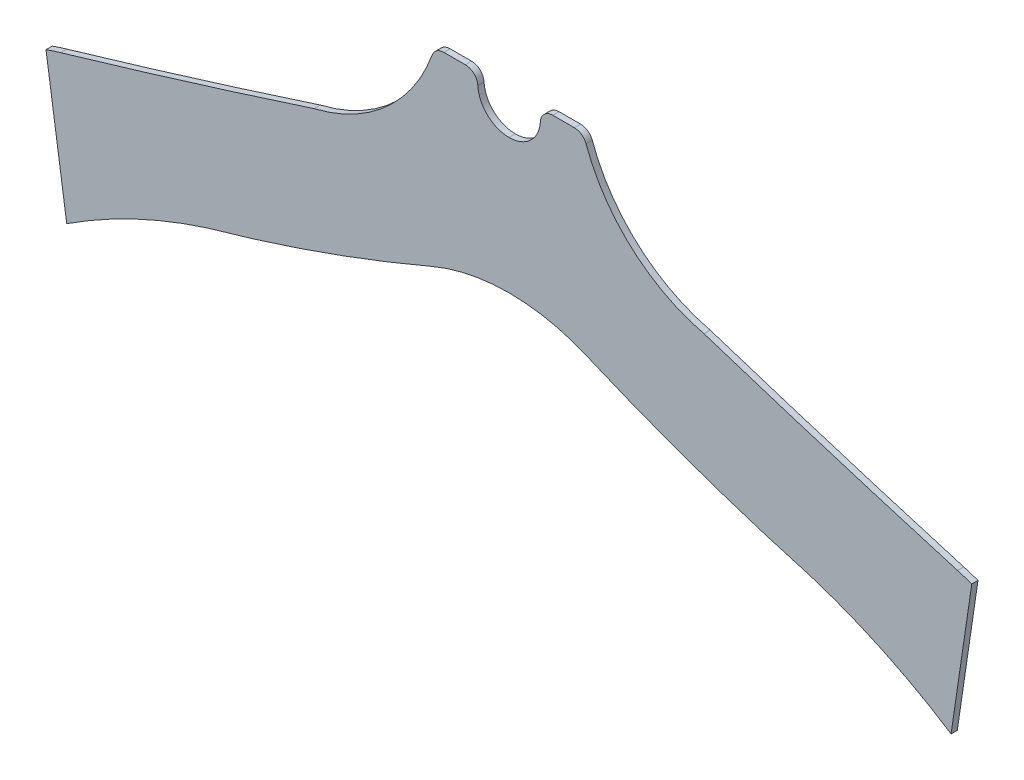
ISO-10303-21;
HEADER;
FILE_DESCRIPTION(('STEP AP214'),'2;1');
FILE_NAME('part.step','',(''),(''),'','','');
FILE_SCHEMA(('AUTOMOTIVE_DESIGN { 1 0 10303 214 1 1 1 1 }'));
ENDSEC;
DATA;
#1=APPLICATION_CONTEXT('core data for automotive mechanical design processes');
#2=APPLICATION_PROTOCOL_DEFINITION('international standard','automotive_design',2000,#1);
#3=PRODUCT_CONTEXT('',#1,'mechanical');
#4=PRODUCT('Part','Part','',(#3));
#5=PRODUCT_RELATED_PRODUCT_CATEGORY('part','',(#4));
#6=PRODUCT_DEFINITION_FORMATION('','',#4);
#7=PRODUCT_DEFINITION_CONTEXT('part definition',#1,'design');
#8=PRODUCT_DEFINITION('design','',#6,#7);
#9=PRODUCT_DEFINITION_SHAPE('','',#8);
#10=(LENGTH_UNIT() NAMED_UNIT(*) SI_UNIT(.MILLI.,.METRE.));
#11=(NAMED_UNIT(*) PLANE_ANGLE_UNIT() SI_UNIT($,.RADIAN.));
#12=(NAMED_UNIT(*) SI_UNIT($,.STERADIAN.) SOLID_ANGLE_UNIT());
#13=UNCERTAINTY_MEASURE_WITH_UNIT(LENGTH_MEASURE(1.E-05),#10,'distance_accuracy_value','');
#14=(GEOMETRIC_REPRESENTATION_CONTEXT(3) GLOBAL_UNCERTAINTY_ASSIGNED_CONTEXT((#13)) GLOBAL_UNIT_ASSIGNED_CONTEXT((#10,
#11,#12)) REPRESENTATION_CONTEXT('',''));
#15=CARTESIAN_POINT('',(0.,0.,0.));
#16=DIRECTION('',(0.,0.,1.));
#17=DIRECTION('',(1.,0.,0.));
#18=AXIS2_PLACEMENT_3D('',#15,#16,#17);
#19=CARTESIAN_POINT('',(-600.745447716728,679.701236138692,0.));
#20=DIRECTION('',(-0.989272155517059,-0.14608423021884,0.));
#21=DIRECTION('',(0.146084230218841,-0.989272155517059,0.));
#22=AXIS2_PLACEMENT_3D('',#19,#20,#21);
#23=PLANE('',#22);
#24=DIRECTION('',(0.,0.,-1.));
#25=VECTOR('',#24,1.);
#26=CARTESIAN_POINT('',(-451.112265587926,-333.604172663373,6.35));
#27=LINE('',#26,#25);
#28=CARTESIAN_POINT('',(-451.112265587926,-333.604172663373,6.35));
#29=VERTEX_POINT('',#28);
#30=CARTESIAN_POINT('',(-451.112265587926,-333.604172663373,0.));
#31=VERTEX_POINT('',#30);
#32=EDGE_CURVE('E268',#29,#31,#27,.T.);
#33=ORIENTED_EDGE('',*,*,#32,.F.);
#34=DIRECTION('',(0.146084230218841,-0.989272155517059,0.));
#35=VECTOR('',#34,1.);
#36=CARTESIAN_POINT('',(-231.23791311845,-1822.57785780754,6.35));
#37=LINE('',#36,#35);
#38=CARTESIAN_POINT('',(-472.255241426129,-190.425424004661,6.35));
#39=VERTEX_POINT('',#38);
#40=EDGE_CURVE('E271',#39,#29,#37,.T.);
#41=ORIENTED_EDGE('',*,*,#40,.F.);
#42=DIRECTION('',(0.,0.,-1.));
#43=VECTOR('',#42,1.);
#44=CARTESIAN_POINT('',(-472.255241426129,-190.425424004661,6.35));
#45=LINE('',#44,#43);
#46=CARTESIAN_POINT('',(-472.255241426129,-190.425424004661,0.));
#47=VERTEX_POINT('',#46);
#48=EDGE_CURVE('E263',#39,#47,#45,.T.);
#49=ORIENTED_EDGE('',*,*,#48,.T.);
#50=DIRECTION('',(0.146084230218841,-0.989272155517059,0.));
#51=VECTOR('',#50,1.);
#52=CARTESIAN_POINT('',(-231.23791311845,-1822.57785780754,0.));
#53=LINE('',#52,#51);
#54=EDGE_CURVE('E260',#47,#31,#53,.T.);
#55=ORIENTED_EDGE('',*,*,#54,.T.);
#56=EDGE_LOOP('',(#33,#41,#49,#55));
#57=FACE_BOUND('',#56,.T.);
#58=ADVANCED_FACE('F36',(#57),#23,.T.);
#59=CARTESIAN_POINT('',(600.745447716728,679.701236138692,0.));
#60=DIRECTION('',(0.989272155517059,-0.14608423021884,0.));
#61=DIRECTION('',(-0.146084230218841,-0.989272155517059,0.));
#62=AXIS2_PLACEMENT_3D('',#59,#60,#61);
#63=PLANE('',#62);
#64=DIRECTION('',(0.,0.,-1.));
#65=VECTOR('',#64,1.);
#66=CARTESIAN_POINT('',(451.151920246399,-333.335634098976,6.35));
#67=LINE('',#66,#65);
#68=CARTESIAN_POINT('',(451.151920246399,-333.335634098976,0.));
#69=VERTEX_POINT('',#68);
#70=CARTESIAN_POINT('',(451.151920246399,-333.335634098976,6.35));
#71=VERTEX_POINT('',#70);
#72=EDGE_CURVE('E272',#69,#71,#67,.F.);
#73=ORIENTED_EDGE('',*,*,#72,.F.);
#74=DIRECTION('',(0.146084230218841,0.989272155517059,0.));
#75=VECTOR('',#74,1.);
#76=CARTESIAN_POINT('',(223.926911417989,-1872.08744827031,0.));
#77=LINE('',#76,#75);
#78=CARTESIAN_POINT('',(472.277440645089,-190.275092451706,0.));
#79=VERTEX_POINT('',#78);
#80=EDGE_CURVE('E264',#69,#79,#77,.T.);
#81=ORIENTED_EDGE('',*,*,#80,.T.);
#82=DIRECTION('',(0.,0.,-1.));
#83=VECTOR('',#82,1.);
#84=CARTESIAN_POINT('',(472.277440645089,-190.275092451706,6.35));
#85=LINE('',#84,#83);
#86=CARTESIAN_POINT('',(472.277440645089,-190.275092451706,6.35));
#87=VERTEX_POINT('',#86);
#88=EDGE_CURVE('E267',#79,#87,#85,.F.);
#89=ORIENTED_EDGE('',*,*,#88,.T.);
#90=DIRECTION('',(0.146084230218841,0.989272155517059,0.));
#91=VECTOR('',#90,1.);
#92=CARTESIAN_POINT('',(223.926911417989,-1872.08744827031,6.35));
#93=LINE('',#92,#91);
#94=EDGE_CURVE('E40',#71,#87,#93,.T.);
#95=ORIENTED_EDGE('',*,*,#94,.F.);
#96=EDGE_LOOP('',(#73,#81,#89,#95));
#97=FACE_BOUND('',#96,.T.);
#98=ADVANCED_FACE('F415',(#97),#63,.T.);
#99=CARTESIAN_POINT('',(-129.060690383093,-828.309515919683,6.35));
#100=DIRECTION('',(0.,0.,-1.));
#101=DIRECTION('',(-1.,0.,0.));
#102=AXIS2_PLACEMENT_3D('',#99,#100,#101);
#103=CYLINDRICAL_SURFACE('',#102,590.297038564702);
#104=CARTESIAN_POINT('',(-129.060690383093,-828.309515919683,6.35));
#105=DIRECTION('',(0.,0.,1.));
#106=DIRECTION('',(1.,0.,0.));
#107=AXIS2_PLACEMENT_3D('',#104,#105,#106);
#108=CIRCLE('',#107,590.297038564702);
#109=CARTESIAN_POINT('',(-307.494270251192,-265.626611155709,6.35));
#110=VERTEX_POINT('',#109);
#111=EDGE_CURVE('E210',#110,#29,#108,.T.);
#112=ORIENTED_EDGE('',*,*,#111,.T.);
#113=ORIENTED_EDGE('',*,*,#32,.T.);
#114=CARTESIAN_POINT('',(-129.060690383093,-828.309515919683,0.));
#115=DIRECTION('',(0.,0.,1.));
#116=DIRECTION('',(1.,0.,0.));
#117=AXIS2_PLACEMENT_3D('',#114,#115,#116);
#118=CIRCLE('',#117,590.297038564702);
#119=CARTESIAN_POINT('',(-307.494270251192,-265.626611155709,0.));
#120=VERTEX_POINT('',#119);
#121=EDGE_CURVE('E251',#120,#31,#118,.T.);
#122=ORIENTED_EDGE('',*,*,#121,.F.);
#123=DIRECTION('',(0.,0.,-1.));
#124=VECTOR('',#123,1.);
#125=CARTESIAN_POINT('',(-307.494270251192,-265.626611155709,6.35));
#126=LINE('',#125,#124);
#127=EDGE_CURVE('E308',#110,#120,#126,.T.);
#128=ORIENTED_EDGE('',*,*,#127,.F.);
#129=EDGE_LOOP('',(#112,#113,#122,#128));
#130=FACE_BOUND('',#129,.T.);
#131=ADVANCED_FACE('F417',(#130),#103,.F.);
#132=CARTESIAN_POINT('',(-803.248156582129,1509.44347893388,6.35));
#133=DIRECTION('',(0.,0.,-1.));
#134=DIRECTION('',(-1.,0.,0.));
#135=AXIS2_PLACEMENT_3D('',#132,#133,#134);
#136=CYLINDRICAL_SURFACE('',#135,1842.99911571951);
#137=CARTESIAN_POINT('',(-803.248156582129,1509.44347893388,0.));
#138=DIRECTION('',(0.,0.,1.));
#139=DIRECTION('',(1.,0.,0.));
#140=AXIS2_PLACEMENT_3D('',#137,#138,#139);
#141=CIRCLE('',#140,1842.99911571951);
#142=CARTESIAN_POINT('',(-78.8538194249149,-185.224212632065,0.));
#143=VERTEX_POINT('',#142);
#144=EDGE_CURVE('E255',#120,#143,#141,.T.);
#145=ORIENTED_EDGE('',*,*,#144,.T.);
#146=DIRECTION('',(0.,0.,-1.));
#147=VECTOR('',#146,1.);
#148=CARTESIAN_POINT('',(-78.8538194249149,-185.224212632065,6.35));
#149=LINE('',#148,#147);
#150=CARTESIAN_POINT('',(-78.8538194249149,-185.224212632065,6.35));
#151=VERTEX_POINT('',#150);
#152=EDGE_CURVE('E311',#151,#143,#149,.T.);
#153=ORIENTED_EDGE('',*,*,#152,.F.);
#154=CARTESIAN_POINT('',(-803.248156582129,1509.44347893388,6.35));
#155=DIRECTION('',(0.,0.,1.));
#156=DIRECTION('',(1.,0.,0.));
#157=AXIS2_PLACEMENT_3D('',#154,#155,#156);
#158=CIRCLE('',#157,1842.99911571951);
#159=EDGE_CURVE('E207',#110,#151,#158,.T.);
#160=ORIENTED_EDGE('',*,*,#159,.F.);
#161=ORIENTED_EDGE('',*,*,#127,.T.);
#162=EDGE_LOOP('',(#145,#153,#160,#161));
#163=FACE_BOUND('',#162,.T.);
#164=ADVANCED_FACE('F423',(#163),#136,.T.);
#165=CARTESIAN_POINT('',(-0.134857005973377,-369.381480964208,6.35));
#166=DIRECTION('',(0.,0.,-1.));
#167=DIRECTION('',(-1.,0.,0.));
#168=AXIS2_PLACEMENT_3D('',#165,#166,#167);
#169=CYLINDRICAL_SURFACE('',#168,200.276245530728);
#170=CARTESIAN_POINT('',(-0.134857005973377,-369.381480964208,0.));
#171=DIRECTION('',(0.,0.,1.));
#172=DIRECTION('',(1.,0.,0.));
#173=AXIS2_PLACEMENT_3D('',#170,#171,#172);
#174=CIRCLE('',#173,200.276245530728);
#175=CARTESIAN_POINT('',(0.226267484348874,-169.105561011291,0.));
#176=VERTEX_POINT('',#175);
#177=EDGE_CURVE('E279',#176,#143,#174,.T.);
#178=ORIENTED_EDGE('',*,*,#177,.F.);
#179=DIRECTION('',(0.,0.,-1.));
#180=VECTOR('',#179,1.);
#181=CARTESIAN_POINT('',(0.226267484348874,-169.105561011291,6.35));
#182=LINE('',#181,#180);
#183=CARTESIAN_POINT('',(0.226267484348874,-169.105561011291,6.35));
#184=VERTEX_POINT('',#183);
#185=EDGE_CURVE('E127',#184,#176,#182,.T.);
#186=ORIENTED_EDGE('',*,*,#185,.F.);
#187=CARTESIAN_POINT('',(-0.134857005973377,-369.381480964208,6.35));
#188=DIRECTION('',(0.,0.,1.));
#189=DIRECTION('',(1.,0.,0.));
#190=AXIS2_PLACEMENT_3D('',#187,#188,#189);
#191=CIRCLE('',#190,200.276245530728);
#192=EDGE_CURVE('E204',#184,#151,#191,.T.);
#193=ORIENTED_EDGE('',*,*,#192,.T.);
#194=ORIENTED_EDGE('',*,*,#152,.T.);
#195=EDGE_LOOP('',(#178,#186,#193,#194));
#196=FACE_BOUND('',#195,.T.);
#197=ADVANCED_FACE('F472',(#196),#169,.F.);
#198=CARTESIAN_POINT('',(0.587391974440798,-369.381480964206,6.35));
#199=DIRECTION('',(0.,0.,-1.));
#200=DIRECTION('',(-1.,0.,0.));
#201=AXIS2_PLACEMENT_3D('',#198,#199,#200);
#202=CYLINDRICAL_SURFACE('',#201,200.276245530727);
#203=CARTESIAN_POINT('',(0.587391974440798,-369.381480964206,0.));
#204=DIRECTION('',(0.,0.,1.));
#205=DIRECTION('',(1.,0.,0.));
#206=AXIS2_PLACEMENT_3D('',#203,#204,#205);
#207=CIRCLE('',#206,200.276245530727);
#208=CARTESIAN_POINT('',(79.3063543933814,-185.224212632063,0.));
#209=VERTEX_POINT('',#208);
#210=EDGE_CURVE('E250',#209,#176,#207,.T.);
#211=ORIENTED_EDGE('',*,*,#210,.F.);
#212=DIRECTION('',(0.,0.,-1.));
#213=VECTOR('',#212,1.);
#214=CARTESIAN_POINT('',(79.3063543933814,-185.224212632063,6.35));
#215=LINE('',#214,#213);
#216=CARTESIAN_POINT('',(79.3063543933814,-185.224212632063,6.35));
#217=VERTEX_POINT('',#216);
#218=EDGE_CURVE('E309',#217,#209,#215,.T.);
#219=ORIENTED_EDGE('',*,*,#218,.F.);
#220=CARTESIAN_POINT('',(0.587391974440798,-369.381480964206,6.35));
#221=DIRECTION('',(0.,0.,1.));
#222=DIRECTION('',(1.,0.,0.));
#223=AXIS2_PLACEMENT_3D('',#220,#221,#222);
#224=CIRCLE('',#223,200.276245530727);
#225=EDGE_CURVE('E214',#217,#184,#224,.T.);
#226=ORIENTED_EDGE('',*,*,#225,.T.);
#227=ORIENTED_EDGE('',*,*,#185,.T.);
#228=EDGE_LOOP('',(#211,#219,#226,#227));
#229=FACE_BOUND('',#228,.T.);
#230=ADVANCED_FACE('F469',(#229),#202,.F.);
#231=CARTESIAN_POINT('',(803.700691550597,1509.44347893388,6.35));
#232=DIRECTION('',(0.,0.,-1.));
#233=DIRECTION('',(-1.,0.,0.));
#234=AXIS2_PLACEMENT_3D('',#231,#232,#233);
#235=CYLINDRICAL_SURFACE('',#234,1842.99911571951);
#236=CARTESIAN_POINT('',(803.700691550597,1509.44347893388,0.));
#237=DIRECTION('',(0.,0.,1.));
#238=DIRECTION('',(1.,0.,0.));
#239=AXIS2_PLACEMENT_3D('',#236,#237,#238);
#240=CIRCLE('',#239,1842.99911571951);
#241=CARTESIAN_POINT('',(307.946805223215,-265.626611156701,0.));
#242=VERTEX_POINT('',#241);
#243=EDGE_CURVE('E277',#209,#242,#240,.T.);
#244=ORIENTED_EDGE('',*,*,#243,.T.);
#245=DIRECTION('',(0.,0.,-1.));
#246=VECTOR('',#245,1.);
#247=CARTESIAN_POINT('',(307.946805223215,-265.626611156701,6.35));
#248=LINE('',#247,#246);
#249=CARTESIAN_POINT('',(307.946805223215,-265.626611156701,6.35));
#250=VERTEX_POINT('',#249);
#251=EDGE_CURVE('E305',#250,#242,#248,.T.);
#252=ORIENTED_EDGE('',*,*,#251,.F.);
#253=CARTESIAN_POINT('',(803.700691550597,1509.44347893388,6.35));
#254=DIRECTION('',(0.,0.,1.));
#255=DIRECTION('',(1.,0.,0.));
#256=AXIS2_PLACEMENT_3D('',#253,#254,#255);
#257=CIRCLE('',#256,1842.99911571951);
#258=EDGE_CURVE('E211',#217,#250,#257,.T.);
#259=ORIENTED_EDGE('',*,*,#258,.F.);
#260=ORIENTED_EDGE('',*,*,#218,.T.);
#261=EDGE_LOOP('',(#244,#252,#259,#260));
#262=FACE_BOUND('',#261,.T.);
#263=ADVANCED_FACE('F306',(#262),#235,.T.);
#264=CARTESIAN_POINT('',(129.513225351562,-828.309515919683,6.35));
#265=DIRECTION('',(0.,0.,-1.));
#266=DIRECTION('',(-1.,0.,0.));
#267=AXIS2_PLACEMENT_3D('',#264,#265,#266);
#268=CYLINDRICAL_SURFACE('',#267,590.297038564749);
#269=CARTESIAN_POINT('',(129.513225351562,-828.309515919683,0.));
#270=DIRECTION('',(0.,0.,1.));
#271=DIRECTION('',(1.,0.,0.));
#272=AXIS2_PLACEMENT_3D('',#269,#270,#271);
#273=CIRCLE('',#272,590.297038564749);
#274=EDGE_CURVE('E254',#69,#242,#273,.T.);
#275=ORIENTED_EDGE('',*,*,#274,.F.);
#276=ORIENTED_EDGE('',*,*,#72,.T.);
#277=CARTESIAN_POINT('',(129.513225351562,-828.309515919683,6.35));
#278=DIRECTION('',(0.,0.,1.));
#279=DIRECTION('',(1.,0.,0.));
#280=AXIS2_PLACEMENT_3D('',#277,#278,#279);
#281=CIRCLE('',#280,590.297038564749);
#282=EDGE_CURVE('E215',#71,#250,#281,.T.);
#283=ORIENTED_EDGE('',*,*,#282,.T.);
#284=ORIENTED_EDGE('',*,*,#251,.T.);
#285=EDGE_LOOP('',(#275,#276,#283,#284));
#286=FACE_BOUND('',#285,.T.);
#287=ADVANCED_FACE('F290',(#286),#268,.F.);
#288=CARTESIAN_POINT('',(371.97218317124,-478.097772800133,6.35));
#289=DIRECTION('',(0.,0.,-1.));
#290=DIRECTION('',(-1.,0.,0.));
#291=AXIS2_PLACEMENT_3D('',#288,#289,#290);
#292=CYLINDRICAL_SURFACE('',#291,304.79999999975);
#293=ORIENTED_EDGE('',*,*,#88,.F.);
#294=CARTESIAN_POINT('',(371.97218317124,-478.097772800133,0.));
#295=DIRECTION('',(0.,0.,1.));
#296=DIRECTION('',(1.,0.,0.));
#297=AXIS2_PLACEMENT_3D('',#294,#295,#296);
#298=CIRCLE('',#297,304.79999999975);
#299=CARTESIAN_POINT('',(457.69894810715,-185.601684324627,0.));
#300=VERTEX_POINT('',#299);
#301=EDGE_CURVE('E11',#79,#300,#298,.T.);
#302=ORIENTED_EDGE('',*,*,#301,.T.);
#303=DIRECTION('',(0.,0.,-1.));
#304=VECTOR('',#303,1.);
#305=CARTESIAN_POINT('',(457.69894810715,-185.601684324627,6.35));
#306=LINE('',#305,#304);
#307=CARTESIAN_POINT('',(457.69894810715,-185.601684324627,6.35));
#308=VERTEX_POINT('',#307);
#309=EDGE_CURVE('E318',#308,#300,#306,.T.);
#310=ORIENTED_EDGE('',*,*,#309,.F.);
#311=CARTESIAN_POINT('',(371.97218317124,-478.097772800133,6.35));
#312=DIRECTION('',(0.,0.,1.));
#313=DIRECTION('',(1.,0.,0.));
#314=AXIS2_PLACEMENT_3D('',#311,#312,#313);
#315=CIRCLE('',#314,304.79999999975);
#316=EDGE_CURVE('E120',#87,#308,#315,.T.);
#317=ORIENTED_EDGE('',*,*,#316,.F.);
#318=EDGE_LOOP('',(#293,#302,#310,#317));
#319=FACE_BOUND('',#318,.T.);
#320=ADVANCED_FACE('F414',(#319),#292,.T.);
#321=CARTESIAN_POINT('',(3096.75380230573,8818.74162178977,6.35));
#322=DIRECTION('',(0.,0.,-1.));
#323=DIRECTION('',(-1.,0.,0.));
#324=AXIS2_PLACEMENT_3D('',#321,#322,#323);
#325=CYLINDRICAL_SURFACE('',#324,9383.11296414128);
#326=CARTESIAN_POINT('',(3096.75380230573,8818.74162178977,0.));
#327=DIRECTION('',(0.,0.,1.));
#328=DIRECTION('',(1.,0.,0.));
#329=AXIS2_PLACEMENT_3D('',#326,#327,#328);
#330=CIRCLE('',#329,9383.11296414128);
#331=CARTESIAN_POINT('',(199.082274062421,-105.736436463515,0.));
#332=VERTEX_POINT('',#331);
#333=EDGE_CURVE('E46',#332,#300,#330,.T.);
#334=ORIENTED_EDGE('',*,*,#333,.F.);
#335=DIRECTION('',(0.,0.,-1.));
#336=VECTOR('',#335,1.);
#337=CARTESIAN_POINT('',(199.082274062421,-105.736436463515,6.35));
#338=LINE('',#337,#336);
#339=CARTESIAN_POINT('',(199.082274062421,-105.736436463515,6.35));
#340=VERTEX_POINT('',#339);
#341=EDGE_CURVE('E113',#340,#332,#338,.T.);
#342=ORIENTED_EDGE('',*,*,#341,.F.);
#343=CARTESIAN_POINT('',(3096.75380230573,8818.74162178977,6.35));
#344=DIRECTION('',(0.,0.,1.));
#345=DIRECTION('',(1.,0.,0.));
#346=AXIS2_PLACEMENT_3D('',#343,#344,#345);
#347=CIRCLE('',#346,9383.11296414128);
#348=EDGE_CURVE('E244',#340,#308,#347,.T.);
#349=ORIENTED_EDGE('',*,*,#348,.T.);
#350=ORIENTED_EDGE('',*,*,#309,.T.);
#351=EDGE_LOOP('',(#334,#342,#349,#350));
#352=FACE_BOUND('',#351,.T.);
#353=ADVANCED_FACE('F410',(#352),#325,.F.);
#354=CARTESIAN_POINT('',(238.935928887626,59.9518608195186,6.35));
#355=DIRECTION('',(0.,0.,-1.));
#356=DIRECTION('',(-1.,0.,0.));
#357=AXIS2_PLACEMENT_3D('',#354,#355,#356);
#358=CYLINDRICAL_SURFACE('',#357,170.413983168864);
#359=CARTESIAN_POINT('',(238.935928887626,59.9518608195186,0.));
#360=DIRECTION('',(0.,0.,1.));
#361=DIRECTION('',(1.,0.,0.));
#362=AXIS2_PLACEMENT_3D('',#359,#360,#361);
#363=CIRCLE('',#362,170.413983168864);
#364=CARTESIAN_POINT('',(78.7529558766412,1.79396525202372,0.));
#365=VERTEX_POINT('',#364);
#366=EDGE_CURVE('E194',#365,#332,#363,.T.);
#367=ORIENTED_EDGE('',*,*,#366,.F.);
#368=DIRECTION('',(0.,0.,-1.));
#369=VECTOR('',#368,1.);
#370=CARTESIAN_POINT('',(78.7529558766412,1.79396525202372,6.35));
#371=LINE('',#370,#369);
#372=CARTESIAN_POINT('',(78.7529558766412,1.79396525202372,6.35));
#373=VERTEX_POINT('',#372);
#374=EDGE_CURVE('E176',#373,#365,#371,.T.);
#375=ORIENTED_EDGE('',*,*,#374,.F.);
#376=CARTESIAN_POINT('',(238.935928887626,59.9518608195186,6.35));
#377=DIRECTION('',(0.,0.,1.));
#378=DIRECTION('',(1.,0.,0.));
#379=AXIS2_PLACEMENT_3D('',#376,#377,#378);
#380=CIRCLE('',#379,170.413983168864);
#381=EDGE_CURVE('E242',#373,#340,#380,.T.);
#382=ORIENTED_EDGE('',*,*,#381,.T.);
#383=ORIENTED_EDGE('',*,*,#341,.T.);
#384=EDGE_LOOP('',(#367,#375,#382,#383));
#385=FACE_BOUND('',#384,.T.);
#386=ADVANCED_FACE('F199',(#385),#358,.F.);
#387=CARTESIAN_POINT('',(66.8154157700438,-2.54021707579355,6.35));
#388=DIRECTION('',(0.,0.,-1.));
#389=DIRECTION('',(-1.,0.,0.));
#390=AXIS2_PLACEMENT_3D('',#387,#388,#389);
#391=CYLINDRICAL_SURFACE('',#390,12.7000000097386);
#392=CARTESIAN_POINT('',(66.8154157700438,-2.54021707579355,0.));
#393=DIRECTION('',(0.,0.,1.));
#394=DIRECTION('',(1.,0.,0.));
#395=AXIS2_PLACEMENT_3D('',#392,#393,#394);
#396=CIRCLE('',#395,12.7000000097386);
#397=CARTESIAN_POINT('',(66.8154157700442,10.159782933945,0.));
#398=VERTEX_POINT('',#397);
#399=EDGE_CURVE('E180',#365,#398,#396,.T.);
#400=ORIENTED_EDGE('',*,*,#399,.T.);
#401=DIRECTION('',(0.,0.,-1.));
#402=VECTOR('',#401,1.);
#403=CARTESIAN_POINT('',(66.8154157700442,10.159782933945,6.35));
#404=LINE('',#403,#402);
#405=CARTESIAN_POINT('',(66.8154157700442,10.159782933945,6.35));
#406=VERTEX_POINT('',#405);
#407=EDGE_CURVE('E187',#406,#398,#404,.T.);
#408=ORIENTED_EDGE('',*,*,#407,.F.);
#409=CARTESIAN_POINT('',(66.8154157700438,-2.54021707579355,6.35));
#410=DIRECTION('',(0.,0.,1.));
#411=DIRECTION('',(1.,0.,0.));
#412=AXIS2_PLACEMENT_3D('',#409,#410,#411);
#413=CIRCLE('',#412,12.7000000097386);
#414=EDGE_CURVE('E182',#373,#406,#413,.T.);
#415=ORIENTED_EDGE('',*,*,#414,.F.);
#416=ORIENTED_EDGE('',*,*,#374,.T.);
#417=EDGE_LOOP('',(#400,#408,#415,#416));
#418=FACE_BOUND('',#417,.T.);
#419=ADVANCED_FACE('F178',(#418),#391,.T.);
#420=CARTESIAN_POINT('',(-171.293236978546,10.159782933945,6.35));
#421=DIRECTION('',(0.,1.,0.));
#422=DIRECTION('',(0.,0.,1.));
#423=AXIS2_PLACEMENT_3D('',#420,#421,#422);
#424=PLANE('',#423);
#425=DIRECTION('',(1.,0.,0.));
#426=VECTOR('',#425,1.);
#427=CARTESIAN_POINT('',(-171.293236978546,10.159782933945,0.));
#428=LINE('',#427,#426);
#429=CARTESIAN_POINT('',(44.8298917581611,10.159782933945,0.));
#430=VERTEX_POINT('',#429);
#431=EDGE_CURVE('E197',#430,#398,#428,.T.);
#432=ORIENTED_EDGE('',*,*,#431,.F.);
#433=DIRECTION('',(0.,0.,-1.));
#434=VECTOR('',#433,1.);
#435=CARTESIAN_POINT('',(44.8298917581611,10.159782933945,6.35));
#436=LINE('',#435,#434);
#437=CARTESIAN_POINT('',(44.8298917581611,10.159782933945,6.35));
#438=VERTEX_POINT('',#437);
#439=EDGE_CURVE('E350',#438,#430,#436,.T.);
#440=ORIENTED_EDGE('',*,*,#439,.F.);
#441=DIRECTION('',(1.,0.,0.));
#442=VECTOR('',#441,1.);
#443=CARTESIAN_POINT('',(-171.293236978546,10.159782933945,6.35));
#444=LINE('',#443,#442);
#445=EDGE_CURVE('E238',#438,#406,#444,.T.);
#446=ORIENTED_EDGE('',*,*,#445,.T.);
#447=ORIENTED_EDGE('',*,*,#407,.T.);
#448=EDGE_LOOP('',(#432,#440,#446,#447));
#449=FACE_BOUND('',#448,.T.);
#450=ADVANCED_FACE('F407',(#449),#424,.T.);
#451=CARTESIAN_POINT('',(44.829891758162,-2.54021706592944,6.35));
#452=DIRECTION('',(0.,0.,-1.));
#453=DIRECTION('',(-1.,0.,0.));
#454=AXIS2_PLACEMENT_3D('',#451,#452,#453);
#455=CYLINDRICAL_SURFACE('',#454,12.6999999998747);
#456=CARTESIAN_POINT('',(44.829891758162,-2.54021706592944,0.));
#457=DIRECTION('',(0.,0.,1.));
#458=DIRECTION('',(1.,0.,0.));
#459=AXIS2_PLACEMENT_3D('',#456,#457,#458);
#460=CIRCLE('',#459,12.6999999998747);
#461=CARTESIAN_POINT('',(32.1506468763009,-1.81444215410306,0.));
#462=VERTEX_POINT('',#461);
#463=EDGE_CURVE('E343',#430,#462,#460,.T.);
#464=ORIENTED_EDGE('',*,*,#463,.T.);
#465=DIRECTION('',(0.,0.,-1.));
#466=VECTOR('',#465,1.);
#467=CARTESIAN_POINT('',(32.1506468763009,-1.81444215410306,6.35));
#468=LINE('',#467,#466);
#469=CARTESIAN_POINT('',(32.1506468763009,-1.81444215410306,6.35));
#470=VERTEX_POINT('',#469);
#471=EDGE_CURVE('E349',#470,#462,#468,.T.);
#472=ORIENTED_EDGE('',*,*,#471,.F.);
#473=CARTESIAN_POINT('',(44.829891758162,-2.54021706592944,6.35));
#474=DIRECTION('',(0.,0.,1.));
#475=DIRECTION('',(1.,0.,0.));
#476=AXIS2_PLACEMENT_3D('',#473,#474,#475);
#477=CIRCLE('',#476,12.6999999998747);
#478=EDGE_CURVE('E236',#438,#470,#477,.T.);
#479=ORIENTED_EDGE('',*,*,#478,.F.);
#480=ORIENTED_EDGE('',*,*,#439,.T.);
#481=EDGE_LOOP('',(#464,#472,#479,#480));
#482=FACE_BOUND('',#481,.T.);
#483=ADVANCED_FACE('F347',(#482),#455,.T.);
#484=CARTESIAN_POINT('',(0.452534671093741,-4.87452744835082E-06,6.35));
#485=DIRECTION('',(0.,0.,-1.));
#486=DIRECTION('',(-1.,0.,0.));
#487=AXIS2_PLACEMENT_3D('',#484,#485,#486);
#488=CYLINDRICAL_SURFACE('',#487,31.7500000002428);
#489=CARTESIAN_POINT('',(0.452534671093741,-4.87452744835082E-06,0.));
#490=DIRECTION('',(0.,0.,1.));
#491=DIRECTION('',(1.,0.,0.));
#492=AXIS2_PLACEMENT_3D('',#489,#490,#491);
#493=CIRCLE('',#492,31.7500000002428);
#494=CARTESIAN_POINT('',(0.225925345642704,-31.749196174921,0.));
#495=VERTEX_POINT('',#494);
#496=EDGE_CURVE('E340',#495,#462,#493,.T.);
#497=ORIENTED_EDGE('',*,*,#496,.F.);
#498=DIRECTION('',(0.,0.,-1.));
#499=VECTOR('',#498,1.);
#500=CARTESIAN_POINT('',(0.225925345642704,-31.749196174921,6.35));
#501=LINE('',#500,#499);
#502=CARTESIAN_POINT('',(0.225925345642704,-31.749196174921,6.35));
#503=VERTEX_POINT('',#502);
#504=EDGE_CURVE('E356',#503,#495,#501,.T.);
#505=ORIENTED_EDGE('',*,*,#504,.F.);
#506=CARTESIAN_POINT('',(0.452534671093741,-4.87452744835082E-06,6.35));
#507=DIRECTION('',(0.,0.,1.));
#508=DIRECTION('',(1.,0.,0.));
#509=AXIS2_PLACEMENT_3D('',#506,#507,#508);
#510=CIRCLE('',#509,31.7500000002428);
#511=EDGE_CURVE('E233',#503,#470,#510,.T.);
#512=ORIENTED_EDGE('',*,*,#511,.T.);
#513=ORIENTED_EDGE('',*,*,#471,.T.);
#514=EDGE_LOOP('',(#497,#505,#512,#513));
#515=FACE_BOUND('',#514,.T.);
#516=ADVANCED_FACE('F355',(#515),#488,.F.);
#517=CARTESIAN_POINT('',(0.,0.,6.35));
#518=DIRECTION('',(0.,0.,-1.));
#519=DIRECTION('',(-1.,0.,0.));
#520=AXIS2_PLACEMENT_3D('',#517,#518,#519);
#521=CYLINDRICAL_SURFACE('',#520,31.7500000002429);
#522=CARTESIAN_POINT('',(0.,0.,0.));
#523=DIRECTION('',(0.,0.,1.));
#524=DIRECTION('',(1.,0.,0.));
#525=AXIS2_PLACEMENT_3D('',#522,#523,#524);
#526=CIRCLE('',#525,31.7500000002429);
#527=CARTESIAN_POINT('',(-31.6981119261832,-1.81444215410309,0.));
#528=VERTEX_POINT('',#527);
#529=EDGE_CURVE('E337',#528,#495,#526,.T.);
#530=ORIENTED_EDGE('',*,*,#529,.F.);
#531=DIRECTION('',(0.,0.,-1.));
#532=VECTOR('',#531,1.);
#533=CARTESIAN_POINT('',(-31.6981119261832,-1.81444215410309,6.35));
#534=LINE('',#533,#532);
#535=CARTESIAN_POINT('',(-31.6981119261832,-1.81444215410309,6.35));
#536=VERTEX_POINT('',#535);
#537=EDGE_CURVE('E359',#536,#528,#534,.T.);
#538=ORIENTED_EDGE('',*,*,#537,.F.);
#539=CARTESIAN_POINT('',(0.,0.,6.35));
#540=DIRECTION('',(0.,0.,1.));
#541=DIRECTION('',(1.,0.,0.));
#542=AXIS2_PLACEMENT_3D('',#539,#540,#541);
#543=CIRCLE('',#542,31.7500000002429);
#544=EDGE_CURVE('E230',#536,#503,#543,.T.);
#545=ORIENTED_EDGE('',*,*,#544,.T.);
#546=ORIENTED_EDGE('',*,*,#504,.T.);
#547=EDGE_LOOP('',(#530,#538,#545,#546));
#548=FACE_BOUND('',#547,.T.);
#549=ADVANCED_FACE('F404',(#548),#521,.F.);
#550=CARTESIAN_POINT('',(-44.3773568080439,-2.54021706592944,6.35));
#551=DIRECTION('',(0.,0.,-1.));
#552=DIRECTION('',(-1.,0.,0.));
#553=AXIS2_PLACEMENT_3D('',#550,#551,#552);
#554=CYLINDRICAL_SURFACE('',#553,12.6999999998749);
#555=CARTESIAN_POINT('',(-44.3773568080439,-2.54021706592944,0.));
#556=DIRECTION('',(0.,0.,1.));
#557=DIRECTION('',(1.,0.,0.));
#558=AXIS2_PLACEMENT_3D('',#555,#556,#557);
#559=CIRCLE('',#558,12.6999999998749);
#560=CARTESIAN_POINT('',(-44.3773568080443,10.159782933945,0.));
#561=VERTEX_POINT('',#560);
#562=EDGE_CURVE('E335',#528,#561,#559,.T.);
#563=ORIENTED_EDGE('',*,*,#562,.T.);
#564=DIRECTION('',(0.,0.,-1.));
#565=VECTOR('',#564,1.);
#566=CARTESIAN_POINT('',(-44.3773568080443,10.159782933945,6.35));
#567=LINE('',#566,#565);
#568=CARTESIAN_POINT('',(-44.3773568080443,10.159782933945,6.35));
#569=VERTEX_POINT('',#568);
#570=EDGE_CURVE('E365',#569,#561,#567,.T.);
#571=ORIENTED_EDGE('',*,*,#570,.F.);
#572=CARTESIAN_POINT('',(-44.3773568080439,-2.54021706592944,6.35));
#573=DIRECTION('',(0.,0.,1.));
#574=DIRECTION('',(1.,0.,0.));
#575=AXIS2_PLACEMENT_3D('',#572,#573,#574);
#576=CIRCLE('',#575,12.6999999998749);
#577=EDGE_CURVE('E228',#536,#569,#576,.T.);
#578=ORIENTED_EDGE('',*,*,#577,.F.);
#579=ORIENTED_EDGE('',*,*,#537,.T.);
#580=EDGE_LOOP('',(#563,#571,#578,#579));
#581=FACE_BOUND('',#580,.T.);
#582=ADVANCED_FACE('F401',(#581),#554,.T.);
#583=CARTESIAN_POINT('',(-171.293236978546,10.159782933945,6.35));
#584=DIRECTION('',(0.,-1.,0.));
#585=DIRECTION('',(0.,0.,-1.));
#586=AXIS2_PLACEMENT_3D('',#583,#584,#585);
#587=PLANE('',#586);
#588=DIRECTION('',(-1.,0.,0.));
#589=VECTOR('',#588,1.);
#590=CARTESIAN_POINT('',(-171.293236978546,10.159782933945,0.));
#591=LINE('',#590,#589);
#592=CARTESIAN_POINT('',(-66.3628808199266,10.159782933945,0.));
#593=VERTEX_POINT('',#592);
#594=EDGE_CURVE('E333',#561,#593,#591,.T.);
#595=ORIENTED_EDGE('',*,*,#594,.T.);
#596=DIRECTION('',(0.,0.,-1.));
#597=VECTOR('',#596,1.);
#598=CARTESIAN_POINT('',(-66.3628808199266,10.159782933945,6.35));
#599=LINE('',#598,#597);
#600=CARTESIAN_POINT('',(-66.3628808199266,10.159782933945,6.35));
#601=VERTEX_POINT('',#600);
#602=EDGE_CURVE('E368',#601,#593,#599,.T.);
#603=ORIENTED_EDGE('',*,*,#602,.F.);
#604=DIRECTION('',(-1.,0.,0.));
#605=VECTOR('',#604,1.);
#606=CARTESIAN_POINT('',(-171.293236978546,10.159782933945,6.35));
#607=LINE('',#606,#605);
#608=EDGE_CURVE('E226',#569,#601,#607,.T.);
#609=ORIENTED_EDGE('',*,*,#608,.F.);
#610=ORIENTED_EDGE('',*,*,#570,.T.);
#611=EDGE_LOOP('',(#595,#603,#609,#610));
#612=FACE_BOUND('',#611,.T.);
#613=ADVANCED_FACE('F397',(#612),#587,.F.);
#614=CARTESIAN_POINT('',(-66.362880819927,-2.54021707579355,6.35));
#615=DIRECTION('',(0.,0.,-1.));
#616=DIRECTION('',(-1.,0.,0.));
#617=AXIS2_PLACEMENT_3D('',#614,#615,#616);
#618=CYLINDRICAL_SURFACE('',#617,12.7000000097385);
#619=CARTESIAN_POINT('',(-66.362880819927,-2.54021707579355,0.));
#620=DIRECTION('',(0.,0.,1.));
#621=DIRECTION('',(1.,0.,0.));
#622=AXIS2_PLACEMENT_3D('',#619,#620,#621);
#623=CIRCLE('',#622,12.7000000097385);
#624=CARTESIAN_POINT('',(-78.3004209264741,1.79396525216031,0.));
#625=VERTEX_POINT('',#624);
#626=EDGE_CURVE('E330',#593,#625,#623,.T.);
#627=ORIENTED_EDGE('',*,*,#626,.T.);
#628=DIRECTION('',(0.,0.,-1.));
#629=VECTOR('',#628,1.);
#630=CARTESIAN_POINT('',(-78.3004209264741,1.79396525216031,6.35));
#631=LINE('',#630,#629);
#632=CARTESIAN_POINT('',(-78.3004209264741,1.79396525216031,6.35));
#633=VERTEX_POINT('',#632);
#634=EDGE_CURVE('E371',#633,#625,#631,.T.);
#635=ORIENTED_EDGE('',*,*,#634,.F.);
#636=CARTESIAN_POINT('',(-66.362880819927,-2.54021707579355,6.35));
#637=DIRECTION('',(0.,0.,1.));
#638=DIRECTION('',(1.,0.,0.));
#639=AXIS2_PLACEMENT_3D('',#636,#637,#638);
#640=CIRCLE('',#639,12.7000000097385);
#641=EDGE_CURVE('E224',#601,#633,#640,.T.);
#642=ORIENTED_EDGE('',*,*,#641,.F.);
#643=ORIENTED_EDGE('',*,*,#602,.T.);
#644=EDGE_LOOP('',(#627,#635,#642,#643));
#645=FACE_BOUND('',#644,.T.);
#646=ADVANCED_FACE('F392',(#645),#618,.T.);
#647=CARTESIAN_POINT('',(-238.483393937508,59.9518608195186,6.35));
#648=DIRECTION('',(0.,0.,-1.));
#649=DIRECTION('',(-1.,0.,0.));
#650=AXIS2_PLACEMENT_3D('',#647,#648,#649);
#651=CYLINDRICAL_SURFACE('',#650,170.413983168863);
#652=CARTESIAN_POINT('',(-238.483393937508,59.9518608195186,0.));
#653=DIRECTION('',(0.,0.,1.));
#654=DIRECTION('',(1.,0.,0.));
#655=AXIS2_PLACEMENT_3D('',#652,#653,#654);
#656=CIRCLE('',#655,170.413983168863);
#657=CARTESIAN_POINT('',(-198.629739112303,-105.736436463515,0.));
#658=VERTEX_POINT('',#657);
#659=EDGE_CURVE('E327',#658,#625,#656,.T.);
#660=ORIENTED_EDGE('',*,*,#659,.F.);
#661=DIRECTION('',(0.,0.,-1.));
#662=VECTOR('',#661,1.);
#663=CARTESIAN_POINT('',(-198.629739112303,-105.736436463515,6.35));
#664=LINE('',#663,#662);
#665=CARTESIAN_POINT('',(-198.629739112303,-105.736436463515,6.35));
#666=VERTEX_POINT('',#665);
#667=EDGE_CURVE('E373',#666,#658,#664,.T.);
#668=ORIENTED_EDGE('',*,*,#667,.F.);
#669=CARTESIAN_POINT('',(-238.483393937508,59.9518608195186,6.35));
#670=DIRECTION('',(0.,0.,1.));
#671=DIRECTION('',(1.,0.,0.));
#672=AXIS2_PLACEMENT_3D('',#669,#670,#671);
#673=CIRCLE('',#672,170.413983168863);
#674=EDGE_CURVE('E221',#666,#633,#673,.T.);
#675=ORIENTED_EDGE('',*,*,#674,.T.);
#676=ORIENTED_EDGE('',*,*,#634,.T.);
#677=EDGE_LOOP('',(#660,#668,#675,#676));
#678=FACE_BOUND('',#677,.T.);
#679=ADVANCED_FACE('F387',(#678),#651,.F.);
#680=CARTESIAN_POINT('',(-3096.30126735561,8818.74162178977,6.35));
#681=DIRECTION('',(0.,0.,-1.));
#682=DIRECTION('',(-1.,0.,0.));
#683=AXIS2_PLACEMENT_3D('',#680,#681,#682);
#684=CYLINDRICAL_SURFACE('',#683,9383.11296414128);
#685=CARTESIAN_POINT('',(-3096.30126735561,8818.74162178977,0.));
#686=DIRECTION('',(0.,0.,1.));
#687=DIRECTION('',(1.,0.,0.));
#688=AXIS2_PLACEMENT_3D('',#685,#686,#687);
#689=CIRCLE('',#688,9383.11296414128);
#690=CARTESIAN_POINT('',(-457.246413172664,-185.601684329207,0.));
#691=VERTEX_POINT('',#690);
#692=EDGE_CURVE('E249',#691,#658,#689,.T.);
#693=ORIENTED_EDGE('',*,*,#692,.F.);
#694=DIRECTION('',(0.,0.,-1.));
#695=VECTOR('',#694,1.);
#696=CARTESIAN_POINT('',(-457.246413172664,-185.601684329207,6.35));
#697=LINE('',#696,#695);
#698=CARTESIAN_POINT('',(-457.246413172664,-185.601684329207,6.35));
#699=VERTEX_POINT('',#698);
#700=EDGE_CURVE('E208',#699,#691,#697,.T.);
#701=ORIENTED_EDGE('',*,*,#700,.F.);
#702=CARTESIAN_POINT('',(-3096.30126735561,8818.74162178977,6.35));
#703=DIRECTION('',(0.,0.,1.));
#704=DIRECTION('',(1.,0.,0.));
#705=AXIS2_PLACEMENT_3D('',#702,#703,#704);
#706=CIRCLE('',#705,9383.11296414128);
#707=EDGE_CURVE('E218',#699,#666,#706,.T.);
#708=ORIENTED_EDGE('',*,*,#707,.T.);
#709=ORIENTED_EDGE('',*,*,#667,.T.);
#710=EDGE_LOOP('',(#693,#701,#708,#709));
#711=FACE_BOUND('',#710,.T.);
#712=ADVANCED_FACE('F383',(#711),#684,.F.);
#713=CARTESIAN_POINT('',(-371.51964822107,-478.097772800309,6.35));
#714=DIRECTION('',(0.,0.,-1.));
#715=DIRECTION('',(-1.,0.,0.));
#716=AXIS2_PLACEMENT_3D('',#713,#714,#715);
#717=CYLINDRICAL_SURFACE('',#716,304.799999999967);
#718=ORIENTED_EDGE('',*,*,#48,.F.);
#719=CARTESIAN_POINT('',(-371.51964822107,-478.097772800309,6.35));
#720=DIRECTION('',(0.,0.,1.));
#721=DIRECTION('',(1.,0.,0.));
#722=AXIS2_PLACEMENT_3D('',#719,#720,#721);
#723=CIRCLE('',#722,304.799999999967);
#724=EDGE_CURVE('E217',#699,#39,#723,.T.);
#725=ORIENTED_EDGE('',*,*,#724,.F.);
#726=ORIENTED_EDGE('',*,*,#700,.T.);
#727=CARTESIAN_POINT('',(-371.51964822107,-478.097772800309,0.));
#728=DIRECTION('',(0.,0.,1.));
#729=DIRECTION('',(1.,0.,0.));
#730=AXIS2_PLACEMENT_3D('',#727,#728,#729);
#731=CIRCLE('',#730,304.799999999967);
#732=EDGE_CURVE('E246',#691,#47,#731,.T.);
#733=ORIENTED_EDGE('',*,*,#732,.T.);
#734=EDGE_LOOP('',(#718,#725,#726,#733));
#735=FACE_BOUND('',#734,.T.);
#736=ADVANCED_FACE('F378',(#735),#717,.T.);
#737=CARTESIAN_POINT('',(-171.293236978546,-1813.72592376616,0.));
#738=DIRECTION('',(0.,0.,1.));
#739=DIRECTION('',(1.,0.,0.));
#740=AXIS2_PLACEMENT_3D('',#737,#738,#739);
#741=PLANE('',#740);
#742=ORIENTED_EDGE('',*,*,#54,.F.);
#743=ORIENTED_EDGE('',*,*,#732,.F.);
#744=ORIENTED_EDGE('',*,*,#692,.T.);
#745=ORIENTED_EDGE('',*,*,#659,.T.);
#746=ORIENTED_EDGE('',*,*,#626,.F.);
#747=ORIENTED_EDGE('',*,*,#594,.F.);
#748=ORIENTED_EDGE('',*,*,#562,.F.);
#749=ORIENTED_EDGE('',*,*,#529,.T.);
#750=ORIENTED_EDGE('',*,*,#496,.T.);
#751=ORIENTED_EDGE('',*,*,#463,.F.);
#752=ORIENTED_EDGE('',*,*,#431,.T.);
#753=ORIENTED_EDGE('',*,*,#399,.F.);
#754=ORIENTED_EDGE('',*,*,#366,.T.);
#755=ORIENTED_EDGE('',*,*,#333,.T.);
#756=ORIENTED_EDGE('',*,*,#301,.F.);
#757=ORIENTED_EDGE('',*,*,#80,.F.);
#758=ORIENTED_EDGE('',*,*,#274,.T.);
#759=ORIENTED_EDGE('',*,*,#243,.F.);
#760=ORIENTED_EDGE('',*,*,#210,.T.);
#761=ORIENTED_EDGE('',*,*,#177,.T.);
#762=ORIENTED_EDGE('',*,*,#144,.F.);
#763=ORIENTED_EDGE('',*,*,#121,.T.);
#764=EDGE_LOOP('',(#742,#743,#744,#745,#746,#747,#748,#749,#750,#751,#752,#753,#754,#755,#756,
#757,#758,#759,#760,#761,#762,#763));
#765=FACE_BOUND('',#764,.T.);
#766=ADVANCED_FACE('F192',(#765),#741,.F.);
#767=CARTESIAN_POINT('',(-171.293236978546,-1813.72592376616,6.35));
#768=DIRECTION('',(0.,0.,1.));
#769=DIRECTION('',(1.,0.,0.));
#770=AXIS2_PLACEMENT_3D('',#767,#768,#769);
#771=PLANE('',#770);
#772=ORIENTED_EDGE('',*,*,#724,.T.);
#773=ORIENTED_EDGE('',*,*,#40,.T.);
#774=ORIENTED_EDGE('',*,*,#111,.F.);
#775=ORIENTED_EDGE('',*,*,#159,.T.);
#776=ORIENTED_EDGE('',*,*,#192,.F.);
#777=ORIENTED_EDGE('',*,*,#225,.F.);
#778=ORIENTED_EDGE('',*,*,#258,.T.);
#779=ORIENTED_EDGE('',*,*,#282,.F.);
#780=ORIENTED_EDGE('',*,*,#94,.T.);
#781=ORIENTED_EDGE('',*,*,#316,.T.);
#782=ORIENTED_EDGE('',*,*,#348,.F.);
#783=ORIENTED_EDGE('',*,*,#381,.F.);
#784=ORIENTED_EDGE('',*,*,#414,.T.);
#785=ORIENTED_EDGE('',*,*,#445,.F.);
#786=ORIENTED_EDGE('',*,*,#478,.T.);
#787=ORIENTED_EDGE('',*,*,#511,.F.);
#788=ORIENTED_EDGE('',*,*,#544,.F.);
#789=ORIENTED_EDGE('',*,*,#577,.T.);
#790=ORIENTED_EDGE('',*,*,#608,.T.);
#791=ORIENTED_EDGE('',*,*,#641,.T.);
#792=ORIENTED_EDGE('',*,*,#674,.F.);
#793=ORIENTED_EDGE('',*,*,#707,.F.);
#794=EDGE_LOOP('',(#772,#773,#774,#775,#776,#777,#778,#779,#780,#781,#782,#783,#784,#785,#786,
#787,#788,#789,#790,#791,#792,#793));
#795=FACE_BOUND('',#794,.T.);
#796=ADVANCED_FACE('F38',(#795),#771,.T.);
#797=CLOSED_SHELL('',(#58,#98,#131,#164,#197,#230,#263,#287,#320,#353,#386,#419,#450,#483,#516,
#549,#582,#613,#646,#679,#712,#736,#766,#796));
#798=MANIFOLD_SOLID_BREP('B2',#797);
#799=ADVANCED_BREP_SHAPE_REPRESENTATION('',(#18,#798),#14);
#800=SHAPE_DEFINITION_REPRESENTATION(#9,#799);
ENDSEC;
END-ISO-10303-21;
